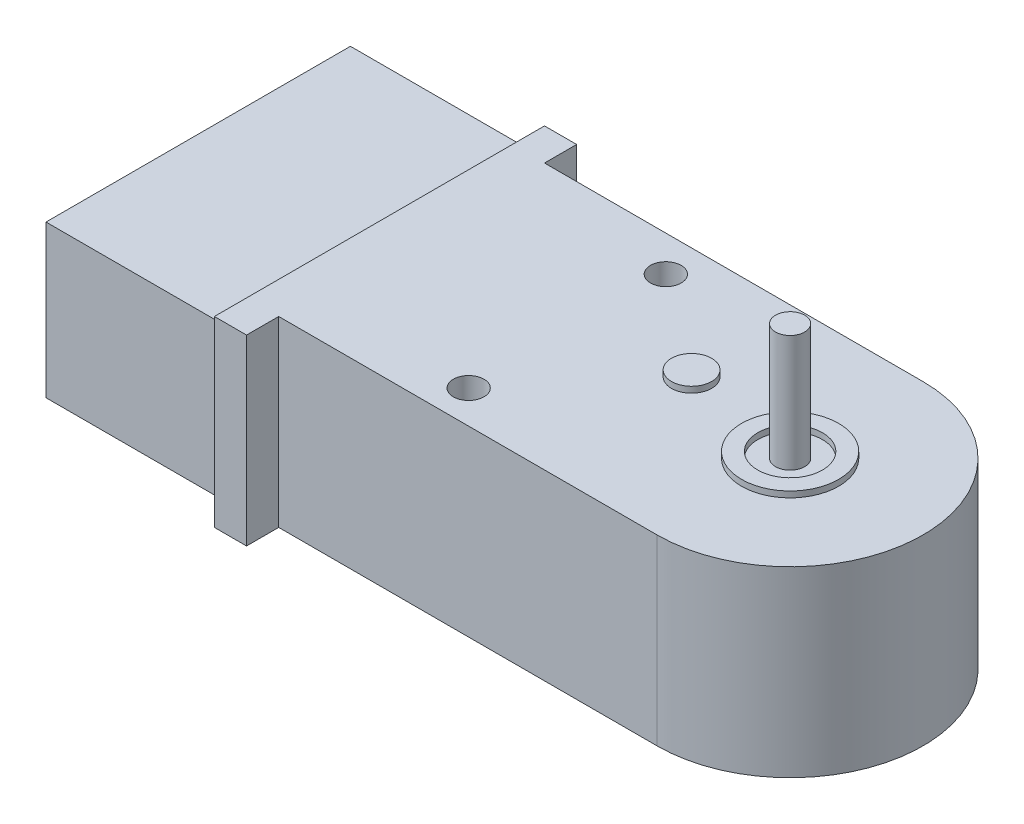
ISO-10303-21;
HEADER;
FILE_DESCRIPTION(('STEP AP214'),'2;1');
FILE_NAME('part.step','',(''),(''),'','','');
FILE_SCHEMA(('AUTOMOTIVE_DESIGN { 1 0 10303 214 1 1 1 1 }'));
ENDSEC;
DATA;
#1=APPLICATION_CONTEXT('core data for automotive mechanical design processes');
#2=APPLICATION_PROTOCOL_DEFINITION('international standard','automotive_design',2000,#1);
#3=PRODUCT_CONTEXT('',#1,'mechanical');
#4=PRODUCT('Part','Part','',(#3));
#5=PRODUCT_RELATED_PRODUCT_CATEGORY('part','',(#4));
#6=PRODUCT_DEFINITION_FORMATION('','',#4);
#7=PRODUCT_DEFINITION_CONTEXT('part definition',#1,'design');
#8=PRODUCT_DEFINITION('design','',#6,#7);
#9=PRODUCT_DEFINITION_SHAPE('','',#8);
#10=(LENGTH_UNIT() NAMED_UNIT(*) SI_UNIT(.MILLI.,.METRE.));
#11=(NAMED_UNIT(*) PLANE_ANGLE_UNIT() SI_UNIT($,.RADIAN.));
#12=(NAMED_UNIT(*) SI_UNIT($,.STERADIAN.) SOLID_ANGLE_UNIT());
#13=UNCERTAINTY_MEASURE_WITH_UNIT(LENGTH_MEASURE(1.E-05),#10,'distance_accuracy_value','');
#14=(GEOMETRIC_REPRESENTATION_CONTEXT(3) GLOBAL_UNCERTAINTY_ASSIGNED_CONTEXT((#13)) GLOBAL_UNIT_ASSIGNED_CONTEXT((#10,
#11,#12)) REPRESENTATION_CONTEXT('',''));
#15=CARTESIAN_POINT('',(0.,0.,0.));
#16=DIRECTION('',(0.,0.,1.));
#17=DIRECTION('',(1.,0.,0.));
#18=AXIS2_PLACEMENT_3D('',#15,#16,#17);
#19=CARTESIAN_POINT('',(0.,6.86,0.));
#20=DIRECTION('',(0.,1.,0.));
#21=DIRECTION('',(0.,0.,1.));
#22=AXIS2_PLACEMENT_3D('',#19,#20,#21);
#23=PLANE('',#22);
#24=CARTESIAN_POINT('',(0.,6.86,0.));
#25=DIRECTION('',(0.,1.,0.));
#26=DIRECTION('',(0.,0.,1.));
#27=AXIS2_PLACEMENT_3D('',#24,#25,#26);
#28=CIRCLE('',#27,2.43);
#29=CARTESIAN_POINT('',(0.,6.86,2.43));
#30=VERTEX_POINT('',#29);
#31=EDGE_CURVE('E41',#30,#30,#28,.F.);
#32=ORIENTED_EDGE('',*,*,#31,.F.);
#33=EDGE_LOOP('',(#32));
#34=FACE_BOUND('',#33,.T.);
#35=CARTESIAN_POINT('',(0.,6.86,0.));
#36=DIRECTION('',(0.,1.,0.));
#37=DIRECTION('',(0.,0.,1.));
#38=AXIS2_PLACEMENT_3D('',#35,#36,#37);
#39=CIRCLE('',#38,1.095);
#40=CARTESIAN_POINT('',(0.,6.86,1.095));
#41=VERTEX_POINT('',#40);
#42=EDGE_CURVE('E228',#41,#41,#39,.T.);
#43=ORIENTED_EDGE('',*,*,#42,.F.);
#44=EDGE_LOOP('',(#43));
#45=FACE_BOUND('',#44,.T.);
#46=ADVANCED_FACE('F33',(#34,#45),#23,.T.);
#47=CARTESIAN_POINT('',(0.,-6.86,0.));
#48=DIRECTION('',(0.,1.,0.));
#49=DIRECTION('',(0.,0.,1.));
#50=AXIS2_PLACEMENT_3D('',#47,#48,#49);
#51=PLANE('',#50);
#52=CARTESIAN_POINT('',(0.,-6.86,0.));
#53=DIRECTION('',(0.,1.,0.));
#54=DIRECTION('',(0.,0.,1.));
#55=AXIS2_PLACEMENT_3D('',#52,#53,#54);
#56=CIRCLE('',#55,9.98);
#57=CARTESIAN_POINT('',(0.,-6.86,9.98));
#58=VERTEX_POINT('',#57);
#59=CARTESIAN_POINT('',(0.,-6.86,-9.98));
#60=VERTEX_POINT('',#59);
#61=EDGE_CURVE('E179',#58,#60,#56,.T.);
#62=ORIENTED_EDGE('',*,*,#61,.F.);
#63=DIRECTION('',(1.,0.,0.));
#64=VECTOR('',#63,1.);
#65=CARTESIAN_POINT('',(-28.425,-6.86,9.98));
#66=LINE('',#65,#64);
#67=CARTESIAN_POINT('',(-28.425,-6.86,9.98));
#68=VERTEX_POINT('',#67);
#69=EDGE_CURVE('E199',#68,#58,#66,.T.);
#70=ORIENTED_EDGE('',*,*,#69,.F.);
#71=DIRECTION('',(0.,0.,-1.));
#72=VECTOR('',#71,1.);
#73=CARTESIAN_POINT('',(-28.425,-6.86,12.395));
#74=LINE('',#73,#72);
#75=CARTESIAN_POINT('',(-28.425,-6.86,12.395));
#76=VERTEX_POINT('',#75);
#77=EDGE_CURVE('E196',#76,#68,#74,.T.);
#78=ORIENTED_EDGE('',*,*,#77,.F.);
#79=DIRECTION('',(1.,0.,0.));
#80=VECTOR('',#79,1.);
#81=CARTESIAN_POINT('',(-30.84,-6.86,12.395));
#82=LINE('',#81,#80);
#83=CARTESIAN_POINT('',(-30.84,-6.86,12.395));
#84=VERTEX_POINT('',#83);
#85=EDGE_CURVE('E193',#84,#76,#82,.T.);
#86=ORIENTED_EDGE('',*,*,#85,.F.);
#87=DIRECTION('',(0.,0.,1.));
#88=VECTOR('',#87,1.);
#89=CARTESIAN_POINT('',(-30.84,-6.86,-12.395));
#90=LINE('',#89,#88);
#91=CARTESIAN_POINT('',(-30.84,-6.86,-12.395));
#92=VERTEX_POINT('',#91);
#93=EDGE_CURVE('E190',#92,#84,#90,.T.);
#94=ORIENTED_EDGE('',*,*,#93,.F.);
#95=DIRECTION('',(-1.,0.,0.));
#96=VECTOR('',#95,1.);
#97=CARTESIAN_POINT('',(-28.425,-6.86,-12.395));
#98=LINE('',#97,#96);
#99=CARTESIAN_POINT('',(-28.425,-6.86,-12.395));
#100=VERTEX_POINT('',#99);
#101=EDGE_CURVE('E187',#100,#92,#98,.T.);
#102=ORIENTED_EDGE('',*,*,#101,.F.);
#103=DIRECTION('',(0.,0.,-1.));
#104=VECTOR('',#103,1.);
#105=CARTESIAN_POINT('',(-28.425,-6.86,-9.98));
#106=LINE('',#105,#104);
#107=CARTESIAN_POINT('',(-28.425,-6.86,-9.98));
#108=VERTEX_POINT('',#107);
#109=EDGE_CURVE('E184',#108,#100,#106,.T.);
#110=ORIENTED_EDGE('',*,*,#109,.F.);
#111=DIRECTION('',(-1.,0.,0.));
#112=VECTOR('',#111,1.);
#113=CARTESIAN_POINT('',(0.,-6.86,-9.98));
#114=LINE('',#113,#112);
#115=EDGE_CURVE('E181',#60,#108,#114,.T.);
#116=ORIENTED_EDGE('',*,*,#115,.F.);
#117=EDGE_LOOP('',(#62,#70,#78,#86,#94,#102,#110,#116));
#118=FACE_BOUND('',#117,.T.);
#119=CARTESIAN_POINT('',(0.,-6.86,0.));
#120=DIRECTION('',(0.,1.,0.));
#121=DIRECTION('',(0.,0.,1.));
#122=AXIS2_PLACEMENT_3D('',#119,#120,#121);
#123=CIRCLE('',#122,3.645);
#124=CARTESIAN_POINT('',(0.,-6.86,3.645));
#125=VERTEX_POINT('',#124);
#126=EDGE_CURVE('E11',#125,#125,#123,.F.);
#127=ORIENTED_EDGE('',*,*,#126,.F.);
#128=EDGE_LOOP('',(#127));
#129=FACE_BOUND('',#128,.T.);
#130=ADVANCED_FACE('F223',(#118,#129),#51,.F.);
#131=CARTESIAN_POINT('',(-16.64,6.86,-7.30523238966054));
#132=DIRECTION('',(0.,1.,0.));
#133=DIRECTION('',(0.,0.,1.));
#134=AXIS2_PLACEMENT_3D('',#131,#132,#133);
#135=CIRCLE('',#134,1.15);
#136=CARTESIAN_POINT('',(-16.64,6.86,-6.15523238966054));
#137=VERTEX_POINT('',#136);
#138=EDGE_CURVE('E356',#137,#137,#135,.T.);
#139=ORIENTED_EDGE('',*,*,#138,.F.);
#140=EDGE_LOOP('',(#139));
#141=FACE_BOUND('',#140,.T.);
#142=CARTESIAN_POINT('',(-16.64,6.86,7.5));
#143=DIRECTION('',(0.,1.,0.));
#144=DIRECTION('',(0.,0.,1.));
#145=AXIS2_PLACEMENT_3D('',#142,#143,#144);
#146=CIRCLE('',#145,1.15);
#147=CARTESIAN_POINT('',(-16.64,6.86,8.65));
#148=VERTEX_POINT('',#147);
#149=EDGE_CURVE('E237',#148,#148,#146,.T.);
#150=ORIENTED_EDGE('',*,*,#149,.F.);
#151=EDGE_LOOP('',(#150));
#152=FACE_BOUND('',#151,.T.);
#153=CARTESIAN_POINT('',(0.,6.86,0.));
#154=DIRECTION('',(0.,1.,0.));
#155=DIRECTION('',(0.,0.,1.));
#156=AXIS2_PLACEMENT_3D('',#153,#154,#155);
#157=CIRCLE('',#156,9.98);
#158=CARTESIAN_POINT('',(0.,6.86,9.98));
#159=VERTEX_POINT('',#158);
#160=CARTESIAN_POINT('',(0.,6.86,-9.98));
#161=VERTEX_POINT('',#160);
#162=EDGE_CURVE('E154',#159,#161,#157,.T.);
#163=ORIENTED_EDGE('',*,*,#162,.T.);
#164=DIRECTION('',(-1.,0.,0.));
#165=VECTOR('',#164,1.);
#166=CARTESIAN_POINT('',(0.,6.86,-9.98));
#167=LINE('',#166,#165);
#168=CARTESIAN_POINT('',(-28.425,6.86,-9.98));
#169=VERTEX_POINT('',#168);
#170=EDGE_CURVE('E157',#161,#169,#167,.T.);
#171=ORIENTED_EDGE('',*,*,#170,.T.);
#172=DIRECTION('',(0.,0.,-1.));
#173=VECTOR('',#172,1.);
#174=CARTESIAN_POINT('',(-28.425,6.86,-9.98));
#175=LINE('',#174,#173);
#176=CARTESIAN_POINT('',(-28.425,6.86,-12.395));
#177=VERTEX_POINT('',#176);
#178=EDGE_CURVE('E161',#169,#177,#175,.T.);
#179=ORIENTED_EDGE('',*,*,#178,.T.);
#180=DIRECTION('',(-1.,0.,0.));
#181=VECTOR('',#180,1.);
#182=CARTESIAN_POINT('',(-28.425,6.86,-12.395));
#183=LINE('',#182,#181);
#184=CARTESIAN_POINT('',(-30.84,6.86,-12.395));
#185=VERTEX_POINT('',#184);
#186=EDGE_CURVE('E164',#177,#185,#183,.T.);
#187=ORIENTED_EDGE('',*,*,#186,.T.);
#188=DIRECTION('',(0.,0.,1.));
#189=VECTOR('',#188,1.);
#190=CARTESIAN_POINT('',(-30.84,6.86,-12.395));
#191=LINE('',#190,#189);
#192=CARTESIAN_POINT('',(-30.84,6.86,12.395));
#193=VERTEX_POINT('',#192);
#194=EDGE_CURVE('E167',#185,#193,#191,.T.);
#195=ORIENTED_EDGE('',*,*,#194,.T.);
#196=DIRECTION('',(1.,0.,0.));
#197=VECTOR('',#196,1.);
#198=CARTESIAN_POINT('',(-30.84,6.86,12.395));
#199=LINE('',#198,#197);
#200=CARTESIAN_POINT('',(-28.425,6.86,12.395));
#201=VERTEX_POINT('',#200);
#202=EDGE_CURVE('E170',#193,#201,#199,.T.);
#203=ORIENTED_EDGE('',*,*,#202,.T.);
#204=DIRECTION('',(0.,0.,-1.));
#205=VECTOR('',#204,1.);
#206=CARTESIAN_POINT('',(-28.425,6.86,12.395));
#207=LINE('',#206,#205);
#208=CARTESIAN_POINT('',(-28.425,6.86,9.98));
#209=VERTEX_POINT('',#208);
#210=EDGE_CURVE('E173',#201,#209,#207,.T.);
#211=ORIENTED_EDGE('',*,*,#210,.T.);
#212=DIRECTION('',(1.,0.,0.));
#213=VECTOR('',#212,1.);
#214=CARTESIAN_POINT('',(-28.425,6.86,9.98));
#215=LINE('',#214,#213);
#216=EDGE_CURVE('E176',#209,#159,#215,.T.);
#217=ORIENTED_EDGE('',*,*,#216,.T.);
#218=EDGE_LOOP('',(#163,#171,#179,#187,#195,#203,#211,#217));
#219=FACE_BOUND('',#218,.T.);
#220=CARTESIAN_POINT('',(-9.,6.86,-1.6));
#221=DIRECTION('',(0.,1.,0.));
#222=DIRECTION('',(0.,0.,1.));
#223=AXIS2_PLACEMENT_3D('',#220,#221,#222);
#224=CIRCLE('',#223,1.51);
#225=CARTESIAN_POINT('',(-9.,6.86,-0.0900000000000018));
#226=VERTEX_POINT('',#225);
#227=EDGE_CURVE('E256',#226,#226,#224,.T.);
#228=ORIENTED_EDGE('',*,*,#227,.F.);
#229=EDGE_LOOP('',(#228));
#230=FACE_BOUND('',#229,.T.);
#231=CARTESIAN_POINT('',(0.,6.86,0.));
#232=DIRECTION('',(0.,1.,0.));
#233=DIRECTION('',(0.,0.,1.));
#234=AXIS2_PLACEMENT_3D('',#231,#232,#233);
#235=CIRCLE('',#234,3.645);
#236=CARTESIAN_POINT('',(0.,6.86,3.645));
#237=VERTEX_POINT('',#236);
#238=EDGE_CURVE('E252',#237,#237,#235,.T.);
#239=ORIENTED_EDGE('',*,*,#238,.F.);
#240=EDGE_LOOP('',(#239));
#241=FACE_BOUND('',#240,.T.);
#242=ADVANCED_FACE('F225',(#141,#152,#219,#230,#241),#23,.T.);
#243=CARTESIAN_POINT('',(0.,-6.86,0.));
#244=DIRECTION('',(0.,1.,0.));
#245=DIRECTION('',(0.,0.,1.));
#246=AXIS2_PLACEMENT_3D('',#243,#244,#245);
#247=CYLINDRICAL_SURFACE('',#246,9.98);
#248=DIRECTION('',(0.,1.,0.));
#249=VECTOR('',#248,1.);
#250=CARTESIAN_POINT('',(0.,-6.86,-9.98));
#251=LINE('',#250,#249);
#252=EDGE_CURVE('E202',#60,#161,#251,.T.);
#253=ORIENTED_EDGE('',*,*,#252,.T.);
#254=ORIENTED_EDGE('',*,*,#162,.F.);
#255=DIRECTION('',(0.,1.,0.));
#256=VECTOR('',#255,1.);
#257=CARTESIAN_POINT('',(0.,-6.86,9.98));
#258=LINE('',#257,#256);
#259=EDGE_CURVE('E56',#58,#159,#258,.T.);
#260=ORIENTED_EDGE('',*,*,#259,.F.);
#261=ORIENTED_EDGE('',*,*,#61,.T.);
#262=EDGE_LOOP('',(#253,#254,#260,#261));
#263=FACE_BOUND('',#262,.T.);
#264=ADVANCED_FACE('F35',(#263),#247,.T.);
#265=CARTESIAN_POINT('',(-28.425,-6.86,9.98));
#266=DIRECTION('',(0.,0.,1.));
#267=DIRECTION('',(1.,0.,0.));
#268=AXIS2_PLACEMENT_3D('',#265,#266,#267);
#269=PLANE('',#268);
#270=ORIENTED_EDGE('',*,*,#259,.T.);
#271=ORIENTED_EDGE('',*,*,#216,.F.);
#272=DIRECTION('',(0.,1.,0.));
#273=VECTOR('',#272,1.);
#274=CARTESIAN_POINT('',(-28.425,-6.86,9.98));
#275=LINE('',#274,#273);
#276=EDGE_CURVE('E204',#68,#209,#275,.T.);
#277=ORIENTED_EDGE('',*,*,#276,.F.);
#278=ORIENTED_EDGE('',*,*,#69,.T.);
#279=EDGE_LOOP('',(#270,#271,#277,#278));
#280=FACE_BOUND('',#279,.T.);
#281=ADVANCED_FACE('F300',(#280),#269,.T.);
#282=CARTESIAN_POINT('',(-28.425,-6.86,12.395));
#283=DIRECTION('',(1.,0.,0.));
#284=DIRECTION('',(0.,0.,-1.));
#285=AXIS2_PLACEMENT_3D('',#282,#283,#284);
#286=PLANE('',#285);
#287=ORIENTED_EDGE('',*,*,#276,.T.);
#288=ORIENTED_EDGE('',*,*,#210,.F.);
#289=DIRECTION('',(0.,1.,0.));
#290=VECTOR('',#289,1.);
#291=CARTESIAN_POINT('',(-28.425,-6.86,12.395));
#292=LINE('',#291,#290);
#293=EDGE_CURVE('E206',#76,#201,#292,.T.);
#294=ORIENTED_EDGE('',*,*,#293,.F.);
#295=ORIENTED_EDGE('',*,*,#77,.T.);
#296=EDGE_LOOP('',(#287,#288,#294,#295));
#297=FACE_BOUND('',#296,.T.);
#298=ADVANCED_FACE('F303',(#297),#286,.T.);
#299=CARTESIAN_POINT('',(-30.84,-6.86,12.395));
#300=DIRECTION('',(0.,0.,1.));
#301=DIRECTION('',(1.,0.,0.));
#302=AXIS2_PLACEMENT_3D('',#299,#300,#301);
#303=PLANE('',#302);
#304=ORIENTED_EDGE('',*,*,#293,.T.);
#305=ORIENTED_EDGE('',*,*,#202,.F.);
#306=DIRECTION('',(0.,1.,0.));
#307=VECTOR('',#306,1.);
#308=CARTESIAN_POINT('',(-30.84,-6.86,12.395));
#309=LINE('',#308,#307);
#310=EDGE_CURVE('E208',#84,#193,#309,.T.);
#311=ORIENTED_EDGE('',*,*,#310,.F.);
#312=ORIENTED_EDGE('',*,*,#85,.T.);
#313=EDGE_LOOP('',(#304,#305,#311,#312));
#314=FACE_BOUND('',#313,.T.);
#315=ADVANCED_FACE('F307',(#314),#303,.T.);
#316=CARTESIAN_POINT('',(-30.84,-6.86,-12.395));
#317=DIRECTION('',(-1.,0.,0.));
#318=DIRECTION('',(0.,0.,1.));
#319=AXIS2_PLACEMENT_3D('',#316,#317,#318);
#320=PLANE('',#319);
#321=DIRECTION('',(0.,0.,-1.));
#322=VECTOR('',#321,1.);
#323=CARTESIAN_POINT('',(-30.84,-5.715,-11.43));
#324=LINE('',#323,#322);
#325=CARTESIAN_POINT('',(-30.84,-5.715,11.43));
#326=VERTEX_POINT('',#325);
#327=CARTESIAN_POINT('',(-30.84,-5.715,-11.43));
#328=VERTEX_POINT('',#327);
#329=EDGE_CURVE('E144',#326,#328,#324,.T.);
#330=ORIENTED_EDGE('',*,*,#329,.T.);
#331=DIRECTION('',(0.,1.,0.));
#332=VECTOR('',#331,1.);
#333=CARTESIAN_POINT('',(-30.84,-5.715,-11.43));
#334=LINE('',#333,#332);
#335=CARTESIAN_POINT('',(-30.84,5.715,-11.43));
#336=VERTEX_POINT('',#335);
#337=EDGE_CURVE('E128',#328,#336,#334,.T.);
#338=ORIENTED_EDGE('',*,*,#337,.T.);
#339=DIRECTION('',(0.,0.,-1.));
#340=VECTOR('',#339,1.);
#341=CARTESIAN_POINT('',(-30.84,5.715,-11.43));
#342=LINE('',#341,#340);
#343=CARTESIAN_POINT('',(-30.84,5.715,11.43));
#344=VERTEX_POINT('',#343);
#345=EDGE_CURVE('E133',#344,#336,#342,.T.);
#346=ORIENTED_EDGE('',*,*,#345,.F.);
#347=DIRECTION('',(0.,1.,0.));
#348=VECTOR('',#347,1.);
#349=CARTESIAN_POINT('',(-30.84,-5.715,11.43));
#350=LINE('',#349,#348);
#351=EDGE_CURVE('E158',#326,#344,#350,.T.);
#352=ORIENTED_EDGE('',*,*,#351,.F.);
#353=EDGE_LOOP('',(#330,#338,#346,#352));
#354=FACE_BOUND('',#353,.T.);
#355=ORIENTED_EDGE('',*,*,#310,.T.);
#356=ORIENTED_EDGE('',*,*,#194,.F.);
#357=DIRECTION('',(0.,1.,0.));
#358=VECTOR('',#357,1.);
#359=CARTESIAN_POINT('',(-30.84,-6.86,-12.395));
#360=LINE('',#359,#358);
#361=EDGE_CURVE('E210',#92,#185,#360,.T.);
#362=ORIENTED_EDGE('',*,*,#361,.F.);
#363=ORIENTED_EDGE('',*,*,#93,.T.);
#364=EDGE_LOOP('',(#355,#356,#362,#363));
#365=FACE_BOUND('',#364,.T.);
#366=ADVANCED_FACE('F142',(#354,#365),#320,.T.);
#367=CARTESIAN_POINT('',(-28.425,-6.86,-12.395));
#368=DIRECTION('',(0.,0.,-1.));
#369=DIRECTION('',(-1.,0.,0.));
#370=AXIS2_PLACEMENT_3D('',#367,#368,#369);
#371=PLANE('',#370);
#372=ORIENTED_EDGE('',*,*,#361,.T.);
#373=ORIENTED_EDGE('',*,*,#186,.F.);
#374=DIRECTION('',(0.,1.,0.));
#375=VECTOR('',#374,1.);
#376=CARTESIAN_POINT('',(-28.425,-6.86,-12.395));
#377=LINE('',#376,#375);
#378=EDGE_CURVE('E212',#100,#177,#377,.T.);
#379=ORIENTED_EDGE('',*,*,#378,.F.);
#380=ORIENTED_EDGE('',*,*,#101,.T.);
#381=EDGE_LOOP('',(#372,#373,#379,#380));
#382=FACE_BOUND('',#381,.T.);
#383=ADVANCED_FACE('F314',(#382),#371,.T.);
#384=CARTESIAN_POINT('',(-28.425,-6.86,-9.98));
#385=DIRECTION('',(1.,0.,0.));
#386=DIRECTION('',(0.,0.,-1.));
#387=AXIS2_PLACEMENT_3D('',#384,#385,#386);
#388=PLANE('',#387);
#389=ORIENTED_EDGE('',*,*,#378,.T.);
#390=ORIENTED_EDGE('',*,*,#178,.F.);
#391=DIRECTION('',(0.,1.,0.));
#392=VECTOR('',#391,1.);
#393=CARTESIAN_POINT('',(-28.425,-6.86,-9.98));
#394=LINE('',#393,#392);
#395=EDGE_CURVE('E214',#108,#169,#394,.T.);
#396=ORIENTED_EDGE('',*,*,#395,.F.);
#397=ORIENTED_EDGE('',*,*,#109,.T.);
#398=EDGE_LOOP('',(#389,#390,#396,#397));
#399=FACE_BOUND('',#398,.T.);
#400=ADVANCED_FACE('F317',(#399),#388,.T.);
#401=CARTESIAN_POINT('',(0.,-6.86,-9.98));
#402=DIRECTION('',(0.,0.,-1.));
#403=DIRECTION('',(-1.,0.,0.));
#404=AXIS2_PLACEMENT_3D('',#401,#402,#403);
#405=PLANE('',#404);
#406=ORIENTED_EDGE('',*,*,#395,.T.);
#407=ORIENTED_EDGE('',*,*,#170,.F.);
#408=ORIENTED_EDGE('',*,*,#252,.F.);
#409=ORIENTED_EDGE('',*,*,#115,.T.);
#410=EDGE_LOOP('',(#406,#407,#408,#409));
#411=FACE_BOUND('',#410,.T.);
#412=ADVANCED_FACE('F291',(#411),#405,.T.);
#413=CARTESIAN_POINT('',(-30.84,-5.715,11.43));
#414=DIRECTION('',(0.,0.,1.));
#415=DIRECTION('',(1.,0.,0.));
#416=AXIS2_PLACEMENT_3D('',#413,#414,#415);
#417=PLANE('',#416);
#418=ORIENTED_EDGE('',*,*,#351,.T.);
#419=DIRECTION('',(1.,0.,0.));
#420=VECTOR('',#419,1.);
#421=CARTESIAN_POINT('',(-30.84,5.715,11.43));
#422=LINE('',#421,#420);
#423=CARTESIAN_POINT('',(-44.45,5.715,11.43));
#424=VERTEX_POINT('',#423);
#425=EDGE_CURVE('E48',#424,#344,#422,.T.);
#426=ORIENTED_EDGE('',*,*,#425,.F.);
#427=DIRECTION('',(0.,1.,0.));
#428=VECTOR('',#427,1.);
#429=CARTESIAN_POINT('',(-44.45,-5.715,11.43));
#430=LINE('',#429,#428);
#431=CARTESIAN_POINT('',(-44.45,-5.715,11.43));
#432=VERTEX_POINT('',#431);
#433=EDGE_CURVE('E147',#432,#424,#430,.T.);
#434=ORIENTED_EDGE('',*,*,#433,.F.);
#435=DIRECTION('',(1.,0.,0.));
#436=VECTOR('',#435,1.);
#437=CARTESIAN_POINT('',(-30.84,-5.715,11.43));
#438=LINE('',#437,#436);
#439=EDGE_CURVE('E145',#432,#326,#438,.T.);
#440=ORIENTED_EDGE('',*,*,#439,.T.);
#441=EDGE_LOOP('',(#418,#426,#434,#440));
#442=FACE_BOUND('',#441,.T.);
#443=ADVANCED_FACE('F275',(#442),#417,.T.);
#444=CARTESIAN_POINT('',(-44.45,-5.715,-11.43));
#445=DIRECTION('',(-1.,0.,0.));
#446=DIRECTION('',(0.,0.,1.));
#447=AXIS2_PLACEMENT_3D('',#444,#445,#446);
#448=PLANE('',#447);
#449=ORIENTED_EDGE('',*,*,#433,.T.);
#450=DIRECTION('',(0.,0.,1.));
#451=VECTOR('',#450,1.);
#452=CARTESIAN_POINT('',(-44.45,5.715,-11.43));
#453=LINE('',#452,#451);
#454=CARTESIAN_POINT('',(-44.45,5.715,-11.43));
#455=VERTEX_POINT('',#454);
#456=EDGE_CURVE('E132',#455,#424,#453,.T.);
#457=ORIENTED_EDGE('',*,*,#456,.F.);
#458=DIRECTION('',(0.,1.,0.));
#459=VECTOR('',#458,1.);
#460=CARTESIAN_POINT('',(-44.45,-5.715,-11.43));
#461=LINE('',#460,#459);
#462=CARTESIAN_POINT('',(-44.45,-5.715,-11.43));
#463=VERTEX_POINT('',#462);
#464=EDGE_CURVE('E130',#463,#455,#461,.T.);
#465=ORIENTED_EDGE('',*,*,#464,.F.);
#466=DIRECTION('',(0.,0.,1.));
#467=VECTOR('',#466,1.);
#468=CARTESIAN_POINT('',(-44.45,-5.715,-11.43));
#469=LINE('',#468,#467);
#470=EDGE_CURVE('E150',#463,#432,#469,.T.);
#471=ORIENTED_EDGE('',*,*,#470,.T.);
#472=EDGE_LOOP('',(#449,#457,#465,#471));
#473=FACE_BOUND('',#472,.T.);
#474=ADVANCED_FACE('F271',(#473),#448,.T.);
#475=CARTESIAN_POINT('',(-30.84,-5.715,-11.43));
#476=DIRECTION('',(0.,0.,-1.));
#477=DIRECTION('',(-1.,0.,0.));
#478=AXIS2_PLACEMENT_3D('',#475,#476,#477);
#479=PLANE('',#478);
#480=ORIENTED_EDGE('',*,*,#464,.T.);
#481=DIRECTION('',(-1.,0.,0.));
#482=VECTOR('',#481,1.);
#483=CARTESIAN_POINT('',(-30.84,5.715,-11.43));
#484=LINE('',#483,#482);
#485=EDGE_CURVE('E124',#336,#455,#484,.T.);
#486=ORIENTED_EDGE('',*,*,#485,.F.);
#487=ORIENTED_EDGE('',*,*,#337,.F.);
#488=DIRECTION('',(-1.,0.,0.));
#489=VECTOR('',#488,1.);
#490=CARTESIAN_POINT('',(-30.84,-5.715,-11.43));
#491=LINE('',#490,#489);
#492=EDGE_CURVE('E266',#328,#463,#491,.T.);
#493=ORIENTED_EDGE('',*,*,#492,.T.);
#494=EDGE_LOOP('',(#480,#486,#487,#493));
#495=FACE_BOUND('',#494,.T.);
#496=ADVANCED_FACE('F125',(#495),#479,.T.);
#497=CARTESIAN_POINT('',(-30.84,-5.715,11.43));
#498=DIRECTION('',(0.,-1.,0.));
#499=DIRECTION('',(0.,0.,-1.));
#500=AXIS2_PLACEMENT_3D('',#497,#498,#499);
#501=PLANE('',#500);
#502=ORIENTED_EDGE('',*,*,#329,.F.);
#503=ORIENTED_EDGE('',*,*,#439,.F.);
#504=ORIENTED_EDGE('',*,*,#470,.F.);
#505=ORIENTED_EDGE('',*,*,#492,.F.);
#506=EDGE_LOOP('',(#502,#503,#504,#505));
#507=FACE_BOUND('',#506,.T.);
#508=ADVANCED_FACE('F277',(#507),#501,.T.);
#509=CARTESIAN_POINT('',(-30.84,5.715,11.43));
#510=DIRECTION('',(0.,-1.,0.));
#511=DIRECTION('',(0.,0.,-1.));
#512=AXIS2_PLACEMENT_3D('',#509,#510,#511);
#513=PLANE('',#512);
#514=ORIENTED_EDGE('',*,*,#345,.T.);
#515=ORIENTED_EDGE('',*,*,#485,.T.);
#516=ORIENTED_EDGE('',*,*,#456,.T.);
#517=ORIENTED_EDGE('',*,*,#425,.T.);
#518=EDGE_LOOP('',(#514,#515,#516,#517));
#519=FACE_BOUND('',#518,.T.);
#520=ADVANCED_FACE('F136',(#519),#513,.F.);
#521=CARTESIAN_POINT('',(-9.,7.31,-1.6));
#522=DIRECTION('',(0.,-1.,0.));
#523=DIRECTION('',(0.,0.,-1.));
#524=AXIS2_PLACEMENT_3D('',#521,#522,#523);
#525=CYLINDRICAL_SURFACE('',#524,1.51);
#526=CARTESIAN_POINT('',(-9.,7.31,-1.6));
#527=DIRECTION('',(0.,1.,0.));
#528=DIRECTION('',(0.,0.,1.));
#529=AXIS2_PLACEMENT_3D('',#526,#527,#528);
#530=CIRCLE('',#529,1.51);
#531=CARTESIAN_POINT('',(-9.,7.31,-0.0900000000000018));
#532=VERTEX_POINT('',#531);
#533=EDGE_CURVE('E139',#532,#532,#530,.T.);
#534=ORIENTED_EDGE('',*,*,#533,.F.);
#535=EDGE_LOOP('',(#534));
#536=FACE_BOUND('',#535,.T.);
#537=ORIENTED_EDGE('',*,*,#227,.T.);
#538=EDGE_LOOP('',(#537));
#539=FACE_BOUND('',#538,.T.);
#540=ADVANCED_FACE('F284',(#536,#539),#525,.T.);
#541=CARTESIAN_POINT('',(-9.,7.31,-1.6));
#542=DIRECTION('',(0.,1.,0.));
#543=DIRECTION('',(0.,0.,1.));
#544=AXIS2_PLACEMENT_3D('',#541,#542,#543);
#545=PLANE('',#544);
#546=ORIENTED_EDGE('',*,*,#533,.T.);
#547=EDGE_LOOP('',(#546));
#548=FACE_BOUND('',#547,.T.);
#549=ADVANCED_FACE('F410',(#548),#545,.T.);
#550=CARTESIAN_POINT('',(0.,7.31,0.));
#551=DIRECTION('',(0.,1.,0.));
#552=DIRECTION('',(0.,0.,1.));
#553=AXIS2_PLACEMENT_3D('',#550,#551,#552);
#554=PLANE('',#553);
#555=CARTESIAN_POINT('',(0.,7.31,0.));
#556=DIRECTION('',(0.,1.,0.));
#557=DIRECTION('',(0.,0.,1.));
#558=AXIS2_PLACEMENT_3D('',#555,#556,#557);
#559=CIRCLE('',#558,3.645);
#560=CARTESIAN_POINT('',(0.,7.31,3.645));
#561=VERTEX_POINT('',#560);
#562=EDGE_CURVE('E253',#561,#561,#559,.T.);
#563=ORIENTED_EDGE('',*,*,#562,.T.);
#564=EDGE_LOOP('',(#563));
#565=FACE_BOUND('',#564,.T.);
#566=CARTESIAN_POINT('',(0.,7.31,0.));
#567=DIRECTION('',(0.,1.,0.));
#568=DIRECTION('',(0.,0.,1.));
#569=AXIS2_PLACEMENT_3D('',#566,#567,#568);
#570=CIRCLE('',#569,2.43);
#571=CARTESIAN_POINT('',(0.,7.31,2.43));
#572=VERTEX_POINT('',#571);
#573=EDGE_CURVE('E249',#572,#572,#570,.T.);
#574=ORIENTED_EDGE('',*,*,#573,.F.);
#575=EDGE_LOOP('',(#574));
#576=FACE_BOUND('',#575,.T.);
#577=ADVANCED_FACE('F407',(#565,#576),#554,.T.);
#578=CARTESIAN_POINT('',(0.,7.31,0.));
#579=DIRECTION('',(0.,-1.,0.));
#580=DIRECTION('',(0.,0.,-1.));
#581=AXIS2_PLACEMENT_3D('',#578,#579,#580);
#582=CYLINDRICAL_SURFACE('',#581,3.645);
#583=ORIENTED_EDGE('',*,*,#562,.F.);
#584=EDGE_LOOP('',(#583));
#585=FACE_BOUND('',#584,.T.);
#586=ORIENTED_EDGE('',*,*,#238,.T.);
#587=EDGE_LOOP('',(#586));
#588=FACE_BOUND('',#587,.T.);
#589=ADVANCED_FACE('F405',(#585,#588),#582,.T.);
#590=CARTESIAN_POINT('',(0.,7.31,0.));
#591=DIRECTION('',(0.,-1.,0.));
#592=DIRECTION('',(0.,0.,-1.));
#593=AXIS2_PLACEMENT_3D('',#590,#591,#592);
#594=CYLINDRICAL_SURFACE('',#593,2.43);
#595=ORIENTED_EDGE('',*,*,#573,.T.);
#596=EDGE_LOOP('',(#595));
#597=FACE_BOUND('',#596,.T.);
#598=ORIENTED_EDGE('',*,*,#31,.T.);
#599=EDGE_LOOP('',(#598));
#600=FACE_BOUND('',#599,.T.);
#601=ADVANCED_FACE('F219',(#597,#600),#594,.F.);
#602=CARTESIAN_POINT('',(0.,-7.31,0.));
#603=DIRECTION('',(0.,-1.,0.));
#604=DIRECTION('',(0.,0.,-1.));
#605=AXIS2_PLACEMENT_3D('',#602,#603,#604);
#606=PLANE('',#605);
#607=CARTESIAN_POINT('',(0.,-7.31,0.));
#608=DIRECTION('',(0.,-1.,0.));
#609=DIRECTION('',(0.,0.,-1.));
#610=AXIS2_PLACEMENT_3D('',#607,#608,#609);
#611=CIRCLE('',#610,3.645);
#612=CARTESIAN_POINT('',(0.,-7.31,-3.645));
#613=VERTEX_POINT('',#612);
#614=EDGE_CURVE('E244',#613,#613,#611,.T.);
#615=ORIENTED_EDGE('',*,*,#614,.T.);
#616=EDGE_LOOP('',(#615));
#617=FACE_BOUND('',#616,.T.);
#618=CARTESIAN_POINT('',(0.,-7.31,0.));
#619=DIRECTION('',(0.,-1.,0.));
#620=DIRECTION('',(0.,0.,-1.));
#621=AXIS2_PLACEMENT_3D('',#618,#619,#620);
#622=CIRCLE('',#621,2.43);
#623=CARTESIAN_POINT('',(0.,-7.31,-2.43));
#624=VERTEX_POINT('',#623);
#625=EDGE_CURVE('E241',#624,#624,#622,.T.);
#626=ORIENTED_EDGE('',*,*,#625,.F.);
#627=EDGE_LOOP('',(#626));
#628=FACE_BOUND('',#627,.T.);
#629=ADVANCED_FACE('F396',(#617,#628),#606,.T.);
#630=CARTESIAN_POINT('',(0.,-7.31,0.));
#631=DIRECTION('',(0.,1.,0.));
#632=DIRECTION('',(0.,0.,1.));
#633=AXIS2_PLACEMENT_3D('',#630,#631,#632);
#634=CYLINDRICAL_SURFACE('',#633,3.645);
#635=ORIENTED_EDGE('',*,*,#614,.F.);
#636=EDGE_LOOP('',(#635));
#637=FACE_BOUND('',#636,.T.);
#638=ORIENTED_EDGE('',*,*,#126,.T.);
#639=EDGE_LOOP('',(#638));
#640=FACE_BOUND('',#639,.T.);
#641=ADVANCED_FACE('F394',(#637,#640),#634,.T.);
#642=CARTESIAN_POINT('',(0.,-7.31,0.));
#643=DIRECTION('',(0.,1.,0.));
#644=DIRECTION('',(0.,0.,1.));
#645=AXIS2_PLACEMENT_3D('',#642,#643,#644);
#646=CYLINDRICAL_SURFACE('',#645,2.43);
#647=ORIENTED_EDGE('',*,*,#625,.T.);
#648=EDGE_LOOP('',(#647));
#649=FACE_BOUND('',#648,.T.);
#650=CARTESIAN_POINT('',(0.,-6.86,0.));
#651=DIRECTION('',(0.,-1.,0.));
#652=DIRECTION('',(0.,0.,-1.));
#653=AXIS2_PLACEMENT_3D('',#650,#651,#652);
#654=CIRCLE('',#653,2.43);
#655=CARTESIAN_POINT('',(0.,-6.86,-2.43));
#656=VERTEX_POINT('',#655);
#657=EDGE_CURVE('E234',#656,#656,#654,.T.);
#658=ORIENTED_EDGE('',*,*,#657,.F.);
#659=EDGE_LOOP('',(#658));
#660=FACE_BOUND('',#659,.T.);
#661=ADVANCED_FACE('F298',(#649,#660),#646,.F.);
#662=ORIENTED_EDGE('',*,*,#657,.T.);
#663=EDGE_LOOP('',(#662));
#664=FACE_BOUND('',#663,.T.);
#665=ADVANCED_FACE('F294',(#664),#51,.F.);
#666=CARTESIAN_POINT('',(0.,15.62,0.));
#667=DIRECTION('',(0.,-1.,0.));
#668=DIRECTION('',(0.,0.,-1.));
#669=AXIS2_PLACEMENT_3D('',#666,#667,#668);
#670=CYLINDRICAL_SURFACE('',#669,1.095);
#671=CARTESIAN_POINT('',(0.,15.62,0.));
#672=DIRECTION('',(0.,1.,0.));
#673=DIRECTION('',(0.,0.,1.));
#674=AXIS2_PLACEMENT_3D('',#671,#672,#673);
#675=CIRCLE('',#674,1.095);
#676=CARTESIAN_POINT('',(0.,15.62,1.095));
#677=VERTEX_POINT('',#676);
#678=EDGE_CURVE('E230',#677,#677,#675,.T.);
#679=ORIENTED_EDGE('',*,*,#678,.F.);
#680=EDGE_LOOP('',(#679));
#681=FACE_BOUND('',#680,.T.);
#682=ORIENTED_EDGE('',*,*,#42,.T.);
#683=EDGE_LOOP('',(#682));
#684=FACE_BOUND('',#683,.T.);
#685=ADVANCED_FACE('F297',(#681,#684),#670,.T.);
#686=CARTESIAN_POINT('',(0.,15.62,0.));
#687=DIRECTION('',(0.,1.,0.));
#688=DIRECTION('',(0.,0.,1.));
#689=AXIS2_PLACEMENT_3D('',#686,#687,#688);
#690=PLANE('',#689);
#691=ORIENTED_EDGE('',*,*,#678,.T.);
#692=EDGE_LOOP('',(#691));
#693=FACE_BOUND('',#692,.T.);
#694=ADVANCED_FACE('F384',(#693),#690,.T.);
#695=CARTESIAN_POINT('',(-16.64,1.86,7.5));
#696=DIRECTION('',(0.,1.,0.));
#697=DIRECTION('',(0.,0.,1.));
#698=AXIS2_PLACEMENT_3D('',#695,#696,#697);
#699=CYLINDRICAL_SURFACE('',#698,1.15);
#700=CARTESIAN_POINT('',(-16.64,1.86,7.5));
#701=DIRECTION('',(0.,1.,0.));
#702=DIRECTION('',(0.,0.,1.));
#703=AXIS2_PLACEMENT_3D('',#700,#701,#702);
#704=CIRCLE('',#703,1.15);
#705=CARTESIAN_POINT('',(-16.64,1.86,8.65));
#706=VERTEX_POINT('',#705);
#707=EDGE_CURVE('E231',#706,#706,#704,.T.);
#708=ORIENTED_EDGE('',*,*,#707,.F.);
#709=EDGE_LOOP('',(#708));
#710=FACE_BOUND('',#709,.T.);
#711=ORIENTED_EDGE('',*,*,#149,.T.);
#712=EDGE_LOOP('',(#711));
#713=FACE_BOUND('',#712,.T.);
#714=ADVANCED_FACE('F377',(#710,#713),#699,.F.);
#715=CARTESIAN_POINT('',(0.,1.86,0.));
#716=DIRECTION('',(0.,1.,0.));
#717=DIRECTION('',(0.,0.,1.));
#718=AXIS2_PLACEMENT_3D('',#715,#716,#717);
#719=PLANE('',#718);
#720=ORIENTED_EDGE('',*,*,#707,.T.);
#721=EDGE_LOOP('',(#720));
#722=FACE_BOUND('',#721,.T.);
#723=ADVANCED_FACE('F368',(#722),#719,.T.);
#724=CARTESIAN_POINT('',(-16.64,1.86,-7.30523238966054));
#725=DIRECTION('',(0.,1.,0.));
#726=DIRECTION('',(0.,0.,1.));
#727=AXIS2_PLACEMENT_3D('',#724,#725,#726);
#728=CYLINDRICAL_SURFACE('',#727,1.15);
#729=CARTESIAN_POINT('',(-16.64,1.86,-7.30523238966054));
#730=DIRECTION('',(0.,1.,0.));
#731=DIRECTION('',(0.,0.,1.));
#732=AXIS2_PLACEMENT_3D('',#729,#730,#731);
#733=CIRCLE('',#732,1.15);
#734=CARTESIAN_POINT('',(-16.64,1.86,-6.15523238966054));
#735=VERTEX_POINT('',#734);
#736=EDGE_CURVE('E360',#735,#735,#733,.T.);
#737=ORIENTED_EDGE('',*,*,#736,.F.);
#738=EDGE_LOOP('',(#737));
#739=FACE_BOUND('',#738,.T.);
#740=ORIENTED_EDGE('',*,*,#138,.T.);
#741=EDGE_LOOP('',(#740));
#742=FACE_BOUND('',#741,.T.);
#743=ADVANCED_FACE('F365',(#739,#742),#728,.F.);
#744=CARTESIAN_POINT('',(0.,1.86,0.));
#745=DIRECTION('',(0.,1.,0.));
#746=DIRECTION('',(0.,0.,1.));
#747=AXIS2_PLACEMENT_3D('',#744,#745,#746);
#748=PLANE('',#747);
#749=ORIENTED_EDGE('',*,*,#736,.T.);
#750=EDGE_LOOP('',(#749));
#751=FACE_BOUND('',#750,.T.);
#752=ADVANCED_FACE('F367',(#751),#748,.T.);
#753=CLOSED_SHELL('',(#46,#130,#242,#264,#281,#298,#315,#366,#383,#400,#412,#443,#474,#496,#508,
#520,#540,#549,#577,#589,#601,#629,#641,#661,#665,#685,#694,#714,#723,#743,#752));
#754=MANIFOLD_SOLID_BREP('B2',#753);
#755=ADVANCED_BREP_SHAPE_REPRESENTATION('',(#18,#754),#14);
#756=SHAPE_DEFINITION_REPRESENTATION(#9,#755);
ENDSEC;
END-ISO-10303-21;
